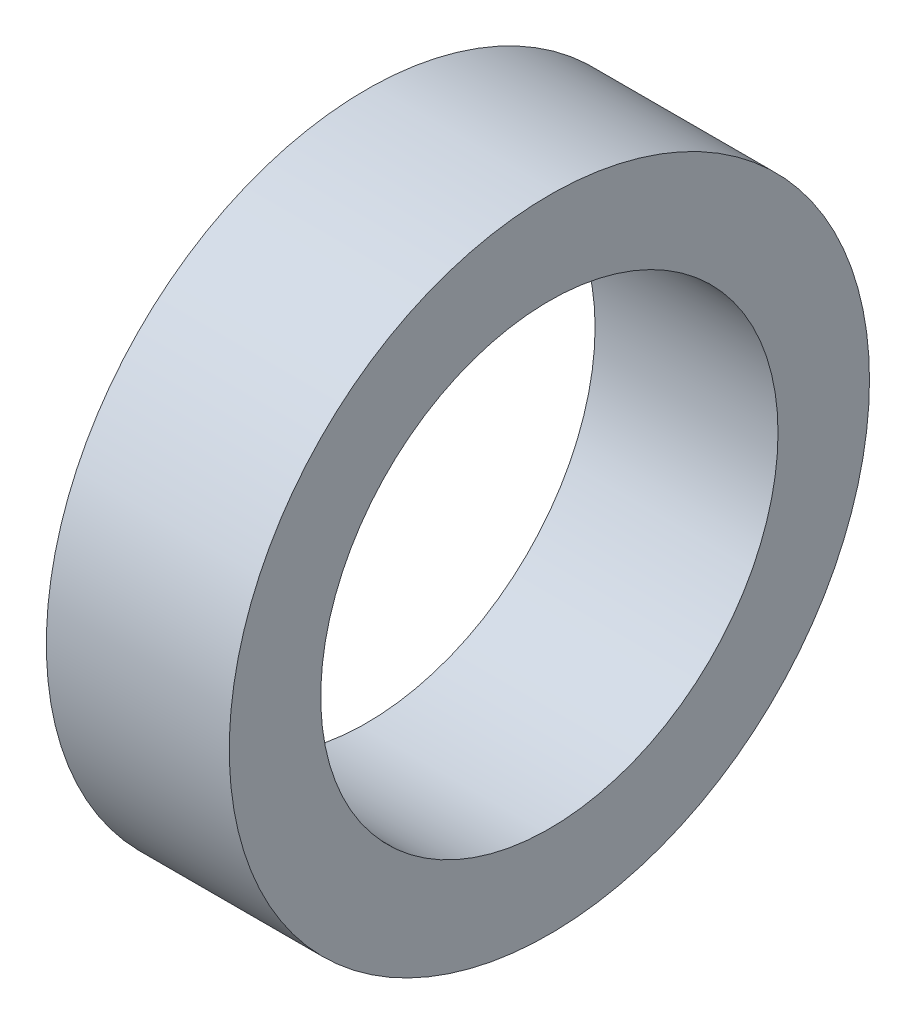
ISO-10303-21;
HEADER;
FILE_DESCRIPTION(('STEP AP214'),'2;1');
FILE_NAME('part.step','',(''),(''),'','','');
FILE_SCHEMA(('AUTOMOTIVE_DESIGN { 1 0 10303 214 1 1 1 1 }'));
ENDSEC;
DATA;
#1=APPLICATION_CONTEXT('core data for automotive mechanical design processes');
#2=APPLICATION_PROTOCOL_DEFINITION('international standard','automotive_design',2000,#1);
#3=PRODUCT_CONTEXT('',#1,'mechanical');
#4=PRODUCT('Part','Part','',(#3));
#5=PRODUCT_RELATED_PRODUCT_CATEGORY('part','',(#4));
#6=PRODUCT_DEFINITION_FORMATION('','',#4);
#7=PRODUCT_DEFINITION_CONTEXT('part definition',#1,'design');
#8=PRODUCT_DEFINITION('design','',#6,#7);
#9=PRODUCT_DEFINITION_SHAPE('','',#8);
#10=(LENGTH_UNIT() NAMED_UNIT(*) SI_UNIT(.MILLI.,.METRE.));
#11=(NAMED_UNIT(*) PLANE_ANGLE_UNIT() SI_UNIT($,.RADIAN.));
#12=(NAMED_UNIT(*) SI_UNIT($,.STERADIAN.) SOLID_ANGLE_UNIT());
#13=UNCERTAINTY_MEASURE_WITH_UNIT(LENGTH_MEASURE(1.E-05),#10,'distance_accuracy_value','');
#14=(GEOMETRIC_REPRESENTATION_CONTEXT(3) GLOBAL_UNCERTAINTY_ASSIGNED_CONTEXT((#13)) GLOBAL_UNIT_ASSIGNED_CONTEXT((#10,
#11,#12)) REPRESENTATION_CONTEXT('',''));
#15=CARTESIAN_POINT('',(0.,0.,0.));
#16=DIRECTION('',(0.,0.,1.));
#17=DIRECTION('',(1.,0.,0.));
#18=AXIS2_PLACEMENT_3D('',#15,#16,#17);
#19=CARTESIAN_POINT('',(20.,0.,0.));
#20=DIRECTION('',(1.,0.,0.));
#21=DIRECTION('',(0.,0.,-1.));
#22=AXIS2_PLACEMENT_3D('',#19,#20,#21);
#23=PLANE('',#22);
#24=CARTESIAN_POINT('',(20.,0.,0.));
#25=DIRECTION('',(1.,0.,0.));
#26=DIRECTION('',(0.,0.,-1.));
#27=AXIS2_PLACEMENT_3D('',#24,#25,#26);
#28=CIRCLE('',#27,35.);
#29=CARTESIAN_POINT('',(20.,0.,-35.));
#30=VERTEX_POINT('',#29);
#31=EDGE_CURVE('E10',#30,#30,#28,.T.);
#32=ORIENTED_EDGE('',*,*,#31,.T.);
#33=EDGE_LOOP('',(#32));
#34=FACE_BOUND('',#33,.T.);
#35=CARTESIAN_POINT('',(20.,0.,0.));
#36=DIRECTION('',(1.,0.,0.));
#37=DIRECTION('',(0.,0.,-1.));
#38=AXIS2_PLACEMENT_3D('',#35,#36,#37);
#39=CIRCLE('',#38,25.);
#40=CARTESIAN_POINT('',(20.,0.,-25.));
#41=VERTEX_POINT('',#40);
#42=EDGE_CURVE('E50',#41,#41,#39,.T.);
#43=ORIENTED_EDGE('',*,*,#42,.F.);
#44=EDGE_LOOP('',(#43));
#45=FACE_BOUND('',#44,.T.);
#46=ADVANCED_FACE('F37',(#34,#45),#23,.T.);
#47=CARTESIAN_POINT('',(0.,0.,0.));
#48=DIRECTION('',(1.,0.,0.));
#49=DIRECTION('',(0.,0.,-1.));
#50=AXIS2_PLACEMENT_3D('',#47,#48,#49);
#51=PLANE('',#50);
#52=CARTESIAN_POINT('',(0.,0.,0.));
#53=DIRECTION('',(1.,0.,0.));
#54=DIRECTION('',(0.,0.,-1.));
#55=AXIS2_PLACEMENT_3D('',#52,#53,#54);
#56=CIRCLE('',#55,35.);
#57=CARTESIAN_POINT('',(0.,0.,-35.));
#58=VERTEX_POINT('',#57);
#59=EDGE_CURVE('E41',#58,#58,#56,.T.);
#60=ORIENTED_EDGE('',*,*,#59,.F.);
#61=EDGE_LOOP('',(#60));
#62=FACE_BOUND('',#61,.T.);
#63=CARTESIAN_POINT('',(0.,0.,0.));
#64=DIRECTION('',(1.,0.,0.));
#65=DIRECTION('',(0.,0.,-1.));
#66=AXIS2_PLACEMENT_3D('',#63,#64,#65);
#67=CIRCLE('',#66,25.);
#68=CARTESIAN_POINT('',(0.,0.,-25.));
#69=VERTEX_POINT('',#68);
#70=EDGE_CURVE('E52',#69,#69,#67,.T.);
#71=ORIENTED_EDGE('',*,*,#70,.T.);
#72=EDGE_LOOP('',(#71));
#73=FACE_BOUND('',#72,.T.);
#74=ADVANCED_FACE('F64',(#62,#73),#51,.F.);
#75=CARTESIAN_POINT('',(20.,0.,0.));
#76=DIRECTION('',(-1.,0.,0.));
#77=DIRECTION('',(0.,0.,1.));
#78=AXIS2_PLACEMENT_3D('',#75,#76,#77);
#79=CYLINDRICAL_SURFACE('',#78,35.);
#80=ORIENTED_EDGE('',*,*,#31,.F.);
#81=EDGE_LOOP('',(#80));
#82=FACE_BOUND('',#81,.T.);
#83=ORIENTED_EDGE('',*,*,#59,.T.);
#84=EDGE_LOOP('',(#83));
#85=FACE_BOUND('',#84,.T.);
#86=ADVANCED_FACE('F39',(#82,#85),#79,.T.);
#87=CARTESIAN_POINT('',(20.,0.,0.));
#88=DIRECTION('',(-1.,0.,0.));
#89=DIRECTION('',(0.,0.,1.));
#90=AXIS2_PLACEMENT_3D('',#87,#88,#89);
#91=CYLINDRICAL_SURFACE('',#90,25.);
#92=ORIENTED_EDGE('',*,*,#42,.T.);
#93=EDGE_LOOP('',(#92));
#94=FACE_BOUND('',#93,.T.);
#95=ORIENTED_EDGE('',*,*,#70,.F.);
#96=EDGE_LOOP('',(#95));
#97=FACE_BOUND('',#96,.T.);
#98=ADVANCED_FACE('F60',(#94,#97),#91,.F.);
#99=CLOSED_SHELL('',(#46,#74,#86,#98));
#100=MANIFOLD_SOLID_BREP('B2',#99);
#101=ADVANCED_BREP_SHAPE_REPRESENTATION('',(#18,#100),#14);
#102=SHAPE_DEFINITION_REPRESENTATION(#9,#101);
ENDSEC;
END-ISO-10303-21;
